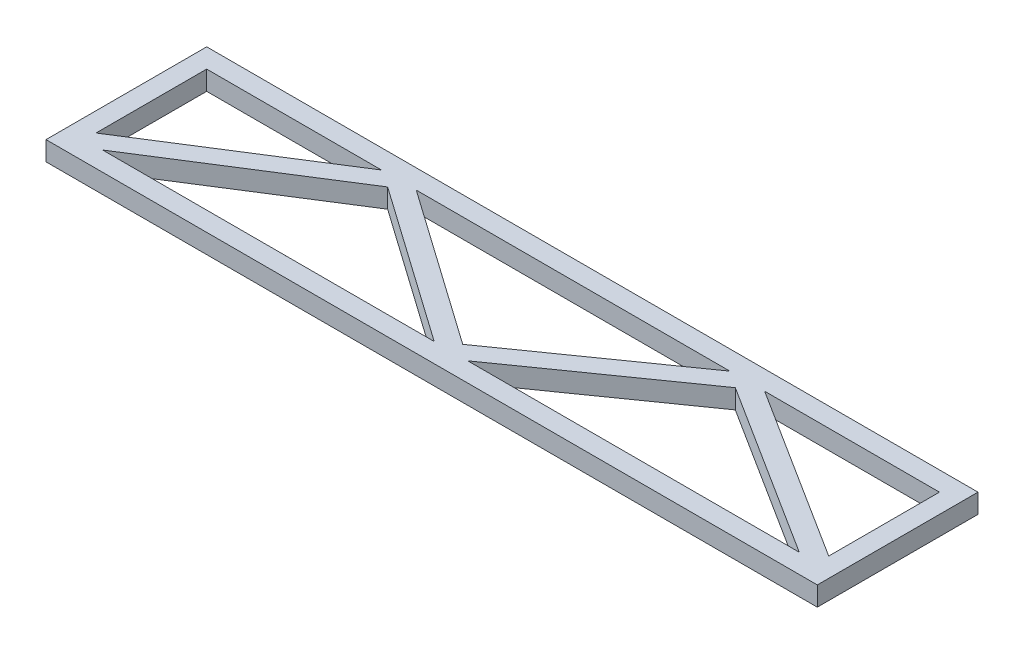
ISO-10303-21;
HEADER;
FILE_DESCRIPTION(('STEP AP214'),'2;1');
FILE_NAME('part.step','',(''),(''),'','','');
FILE_SCHEMA(('AUTOMOTIVE_DESIGN { 1 0 10303 214 1 1 1 1 }'));
ENDSEC;
DATA;
#1=APPLICATION_CONTEXT('core data for automotive mechanical design processes');
#2=APPLICATION_PROTOCOL_DEFINITION('international standard','automotive_design',2000,#1);
#3=PRODUCT_CONTEXT('',#1,'mechanical');
#4=PRODUCT('Part','Part','',(#3));
#5=PRODUCT_RELATED_PRODUCT_CATEGORY('part','',(#4));
#6=PRODUCT_DEFINITION_FORMATION('','',#4);
#7=PRODUCT_DEFINITION_CONTEXT('part definition',#1,'design');
#8=PRODUCT_DEFINITION('design','',#6,#7);
#9=PRODUCT_DEFINITION_SHAPE('','',#8);
#10=(LENGTH_UNIT() NAMED_UNIT(*) SI_UNIT(.MILLI.,.METRE.));
#11=(NAMED_UNIT(*) PLANE_ANGLE_UNIT() SI_UNIT($,.RADIAN.));
#12=(NAMED_UNIT(*) SI_UNIT($,.STERADIAN.) SOLID_ANGLE_UNIT());
#13=UNCERTAINTY_MEASURE_WITH_UNIT(LENGTH_MEASURE(1.E-05),#10,'distance_accuracy_value','');
#14=(GEOMETRIC_REPRESENTATION_CONTEXT(3) GLOBAL_UNCERTAINTY_ASSIGNED_CONTEXT((#13)) GLOBAL_UNIT_ASSIGNED_CONTEXT((#10,
#11,#12)) REPRESENTATION_CONTEXT('',''));
#15=CARTESIAN_POINT('',(0.,0.,0.));
#16=DIRECTION('',(0.,0.,1.));
#17=DIRECTION('',(1.,0.,0.));
#18=AXIS2_PLACEMENT_3D('',#15,#16,#17);
#19=CARTESIAN_POINT('',(0.,3.,0.));
#20=DIRECTION('',(0.,-1.,0.));
#21=DIRECTION('',(0.,0.,-1.));
#22=AXIS2_PLACEMENT_3D('',#19,#20,#21);
#23=PLANE('',#22);
#24=DIRECTION('',(1.,0.,0.));
#25=VECTOR('',#24,1.);
#26=CARTESIAN_POINT('',(36.2724669608045,3.,9.5));
#27=LINE('',#26,#25);
#28=CARTESIAN_POINT('',(36.2724669608045,3.,9.5));
#29=VERTEX_POINT('',#28);
#30=CARTESIAN_POINT('',(87.8625424991544,3.,9.5));
#31=VERTEX_POINT('',#30);
#32=EDGE_CURVE('E197',#29,#31,#27,.T.);
#33=ORIENTED_EDGE('',*,*,#32,.F.);
#34=DIRECTION('',(-0.817806419300766,0.,0.575493406174614));
#35=VECTOR('',#34,1.);
#36=CARTESIAN_POINT('',(60.7098711631808,3.,-7.69669184611664));
#37=LINE('',#36,#35);
#38=CARTESIAN_POINT('',(60.7098711631808,3.,-7.69669184611664));
#39=VERTEX_POINT('',#38);
#40=EDGE_CURVE('E203',#39,#29,#37,.T.);
#41=ORIENTED_EDGE('',*,*,#40,.F.);
#42=DIRECTION('',(-0.844819075554229,0.,-0.535052081184345));
#43=VECTOR('',#42,1.);
#44=CARTESIAN_POINT('',(87.8625424991544,3.,9.5));
#45=LINE('',#44,#43);
#46=EDGE_CURVE('E199',#31,#39,#45,.T.);
#47=ORIENTED_EDGE('',*,*,#46,.F.);
#48=EDGE_LOOP('',(#33,#41,#47));
#49=FACE_BOUND('',#48,.T.);
#50=DIRECTION('',(-1.,0.,0.));
#51=VECTOR('',#50,1.);
#52=CARTESIAN_POINT('',(63.4694733111222,3.,-9.50000000000001));
#53=LINE('',#52,#51);
#54=CARTESIAN_POINT('',(90.6660079051383,3.,-9.5));
#55=VERTEX_POINT('',#54);
#56=CARTESIAN_POINT('',(63.4694733111222,3.,-9.50000000000001));
#57=VERTEX_POINT('',#56);
#58=EDGE_CURVE('E245',#55,#57,#53,.T.);
#59=ORIENTED_EDGE('',*,*,#58,.F.);
#60=DIRECTION('',(0.,0.,-1.));
#61=VECTOR('',#60,1.);
#62=CARTESIAN_POINT('',(90.6660079051383,3.,7.72447190954353));
#63=LINE('',#62,#61);
#64=CARTESIAN_POINT('',(90.6660079051383,3.,7.72447190954353));
#65=VERTEX_POINT('',#64);
#66=EDGE_CURVE('E251',#65,#55,#63,.T.);
#67=ORIENTED_EDGE('',*,*,#66,.F.);
#68=DIRECTION('',(0.844819075554229,0.,0.535052081184345));
#69=VECTOR('',#68,1.);
#70=CARTESIAN_POINT('',(90.6660079051383,3.,7.72447190954353));
#71=LINE('',#70,#69);
#72=EDGE_CURVE('E247',#57,#65,#71,.T.);
#73=ORIENTED_EDGE('',*,*,#72,.F.);
#74=EDGE_LOOP('',(#59,#67,#73));
#75=FACE_BOUND('',#74,.T.);
#76=DIRECTION('',(0.,0.,-1.));
#77=VECTOR('',#76,1.);
#78=CARTESIAN_POINT('',(93.6660079051383,3.,12.5));
#79=LINE('',#78,#77);
#80=CARTESIAN_POINT('',(93.6660079051383,3.,12.5));
#81=VERTEX_POINT('',#80);
#82=CARTESIAN_POINT('',(93.6660079051383,3.,-12.5));
#83=VERTEX_POINT('',#82);
#84=EDGE_CURVE('E293',#81,#83,#79,.T.);
#85=ORIENTED_EDGE('',*,*,#84,.T.);
#86=DIRECTION('',(-1.,0.,0.));
#87=VECTOR('',#86,1.);
#88=CARTESIAN_POINT('',(-26.3339920948617,3.,-12.5));
#89=LINE('',#88,#87);
#90=CARTESIAN_POINT('',(-26.3339920948617,3.,-12.5));
#91=VERTEX_POINT('',#90);
#92=EDGE_CURVE('E296',#83,#91,#89,.T.);
#93=ORIENTED_EDGE('',*,*,#92,.T.);
#94=DIRECTION('',(0.,0.,1.));
#95=VECTOR('',#94,1.);
#96=CARTESIAN_POINT('',(-26.3339920948617,3.,12.5));
#97=LINE('',#96,#95);
#98=CARTESIAN_POINT('',(-26.3339920948617,3.,12.5));
#99=VERTEX_POINT('',#98);
#100=EDGE_CURVE('E299',#91,#99,#97,.T.);
#101=ORIENTED_EDGE('',*,*,#100,.T.);
#102=DIRECTION('',(1.,0.,0.));
#103=VECTOR('',#102,1.);
#104=CARTESIAN_POINT('',(-26.3339920948617,3.,12.5));
#105=LINE('',#104,#103);
#106=EDGE_CURVE('E301',#99,#81,#105,.T.);
#107=ORIENTED_EDGE('',*,*,#106,.T.);
#108=EDGE_LOOP('',(#85,#93,#101,#107));
#109=FACE_BOUND('',#108,.T.);
#110=DIRECTION('',(-1.,0.,0.));
#111=VECTOR('',#110,1.);
#112=CARTESIAN_POINT('',(-23.3339920948617,3.,-9.5));
#113=LINE('',#112,#111);
#114=CARTESIAN_POINT('',(3.86254249915444,3.,-9.5));
#115=VERTEX_POINT('',#114);
#116=CARTESIAN_POINT('',(-23.3339920948617,3.,-9.5));
#117=VERTEX_POINT('',#116);
#118=EDGE_CURVE('E269',#115,#117,#113,.T.);
#119=ORIENTED_EDGE('',*,*,#118,.F.);
#120=DIRECTION('',(0.844819075554228,0.,-0.535052081184345));
#121=VECTOR('',#120,1.);
#122=CARTESIAN_POINT('',(-23.3339920948617,3.,7.72447190954353));
#123=LINE('',#122,#121);
#124=CARTESIAN_POINT('',(-23.3339920948617,3.,7.72447190954353));
#125=VERTEX_POINT('',#124);
#126=EDGE_CURVE('E275',#125,#115,#123,.T.);
#127=ORIENTED_EDGE('',*,*,#126,.F.);
#128=DIRECTION('',(0.,0.,1.));
#129=VECTOR('',#128,1.);
#130=CARTESIAN_POINT('',(-23.3339920948617,3.,7.72447190954353));
#131=LINE('',#130,#129);
#132=EDGE_CURVE('E271',#117,#125,#131,.T.);
#133=ORIENTED_EDGE('',*,*,#132,.F.);
#134=EDGE_LOOP('',(#119,#127,#133));
#135=FACE_BOUND('',#134,.T.);
#136=DIRECTION('',(-0.817806419300766,0.,-0.575493406174614));
#137=VECTOR('',#136,1.);
#138=CARTESIAN_POINT('',(6.62214464709587,3.,-7.69669184611664));
#139=LINE('',#138,#137);
#140=CARTESIAN_POINT('',(31.0595488494721,3.,9.5));
#141=VERTEX_POINT('',#140);
#142=CARTESIAN_POINT('',(6.62214464709587,3.,-7.69669184611664));
#143=VERTEX_POINT('',#142);
#144=EDGE_CURVE('E221',#141,#143,#139,.T.);
#145=ORIENTED_EDGE('',*,*,#144,.F.);
#146=DIRECTION('',(1.,0.,0.));
#147=VECTOR('',#146,1.);
#148=CARTESIAN_POINT('',(-20.5305266888778,3.,9.5));
#149=LINE('',#148,#147);
#150=CARTESIAN_POINT('',(-20.5305266888778,3.,9.5));
#151=VERTEX_POINT('',#150);
#152=EDGE_CURVE('E227',#151,#141,#149,.T.);
#153=ORIENTED_EDGE('',*,*,#152,.F.);
#154=DIRECTION('',(-0.844819075554229,0.,0.535052081184345));
#155=VECTOR('',#154,1.);
#156=CARTESIAN_POINT('',(-20.5305266888778,3.,9.5));
#157=LINE('',#156,#155);
#158=EDGE_CURVE('E223',#143,#151,#157,.T.);
#159=ORIENTED_EDGE('',*,*,#158,.F.);
#160=EDGE_LOOP('',(#145,#153,#159));
#161=FACE_BOUND('',#160,.T.);
#162=DIRECTION('',(0.817806419300767,0.,-0.575493406174613));
#163=VECTOR('',#162,1.);
#164=CARTESIAN_POINT('',(58.0595488494722,3.,-9.50000000000001));
#165=LINE('',#164,#163);
#166=CARTESIAN_POINT('',(33.6660079051383,3.,7.66582510897565));
#167=VERTEX_POINT('',#166);
#168=CARTESIAN_POINT('',(58.0595488494722,3.,-9.50000000000001));
#169=VERTEX_POINT('',#168);
#170=EDGE_CURVE('E170',#167,#169,#165,.T.);
#171=ORIENTED_EDGE('',*,*,#170,.F.);
#172=DIRECTION('',(0.817806419300767,0.,0.575493406174613));
#173=VECTOR('',#172,1.);
#174=CARTESIAN_POINT('',(9.2724669608045,3.,-9.50000000000001));
#175=LINE('',#174,#173);
#176=CARTESIAN_POINT('',(9.2724669608045,3.,-9.50000000000001));
#177=VERTEX_POINT('',#176);
#178=EDGE_CURVE('E187',#177,#167,#175,.T.);
#179=ORIENTED_EDGE('',*,*,#178,.F.);
#180=DIRECTION('',(-1.,0.,0.));
#181=VECTOR('',#180,1.);
#182=CARTESIAN_POINT('',(9.2724669608045,3.,-9.50000000000001));
#183=LINE('',#182,#181);
#184=EDGE_CURVE('E178',#169,#177,#183,.T.);
#185=ORIENTED_EDGE('',*,*,#184,.F.);
#186=EDGE_LOOP('',(#171,#179,#185));
#187=FACE_BOUND('',#186,.T.);
#188=ADVANCED_FACE('F39',(#49,#75,#109,#135,#161,#187),#23,.F.);
#189=CARTESIAN_POINT('',(0.,0.,0.));
#190=DIRECTION('',(0.,-1.,0.));
#191=DIRECTION('',(0.,0.,-1.));
#192=AXIS2_PLACEMENT_3D('',#189,#190,#191);
#193=PLANE('',#192);
#194=DIRECTION('',(0.,0.,-1.));
#195=VECTOR('',#194,1.);
#196=CARTESIAN_POINT('',(93.6660079051383,0.,12.5));
#197=LINE('',#196,#195);
#198=CARTESIAN_POINT('',(93.6660079051383,0.,12.5));
#199=VERTEX_POINT('',#198);
#200=CARTESIAN_POINT('',(93.6660079051383,0.,-12.5));
#201=VERTEX_POINT('',#200);
#202=EDGE_CURVE('E292',#199,#201,#197,.T.);
#203=ORIENTED_EDGE('',*,*,#202,.F.);
#204=DIRECTION('',(1.,0.,0.));
#205=VECTOR('',#204,1.);
#206=CARTESIAN_POINT('',(-26.3339920948617,0.,12.5));
#207=LINE('',#206,#205);
#208=CARTESIAN_POINT('',(-26.3339920948617,0.,12.5));
#209=VERTEX_POINT('',#208);
#210=EDGE_CURVE('E297',#209,#199,#207,.T.);
#211=ORIENTED_EDGE('',*,*,#210,.F.);
#212=DIRECTION('',(0.,0.,1.));
#213=VECTOR('',#212,1.);
#214=CARTESIAN_POINT('',(-26.3339920948617,0.,12.5));
#215=LINE('',#214,#213);
#216=CARTESIAN_POINT('',(-26.3339920948617,0.,-12.5));
#217=VERTEX_POINT('',#216);
#218=EDGE_CURVE('E308',#217,#209,#215,.T.);
#219=ORIENTED_EDGE('',*,*,#218,.F.);
#220=DIRECTION('',(-1.,0.,0.));
#221=VECTOR('',#220,1.);
#222=CARTESIAN_POINT('',(-26.3339920948617,0.,-12.5));
#223=LINE('',#222,#221);
#224=EDGE_CURVE('E306',#201,#217,#223,.T.);
#225=ORIENTED_EDGE('',*,*,#224,.F.);
#226=EDGE_LOOP('',(#203,#211,#219,#225));
#227=FACE_BOUND('',#226,.T.);
#228=DIRECTION('',(0.844819075554228,0.,-0.535052081184345));
#229=VECTOR('',#228,1.);
#230=CARTESIAN_POINT('',(-23.3339920948617,0.,7.72447190954353));
#231=LINE('',#230,#229);
#232=CARTESIAN_POINT('',(-23.3339920948617,0.,7.72447190954353));
#233=VERTEX_POINT('',#232);
#234=CARTESIAN_POINT('',(3.86254249915444,0.,-9.50000000000001));
#235=VERTEX_POINT('',#234);
#236=EDGE_CURVE('E272',#233,#235,#231,.T.);
#237=ORIENTED_EDGE('',*,*,#236,.T.);
#238=DIRECTION('',(-1.,0.,0.));
#239=VECTOR('',#238,1.);
#240=CARTESIAN_POINT('',(-23.3339920948617,0.,-9.5));
#241=LINE('',#240,#239);
#242=CARTESIAN_POINT('',(-23.3339920948617,0.,-9.5));
#243=VERTEX_POINT('',#242);
#244=EDGE_CURVE('E268',#235,#243,#241,.T.);
#245=ORIENTED_EDGE('',*,*,#244,.T.);
#246=DIRECTION('',(0.,0.,1.));
#247=VECTOR('',#246,1.);
#248=CARTESIAN_POINT('',(-23.3339920948617,0.,7.72447190954353));
#249=LINE('',#248,#247);
#250=EDGE_CURVE('E280',#243,#233,#249,.T.);
#251=ORIENTED_EDGE('',*,*,#250,.T.);
#252=EDGE_LOOP('',(#237,#245,#251));
#253=FACE_BOUND('',#252,.T.);
#254=DIRECTION('',(0.,0.,-1.));
#255=VECTOR('',#254,1.);
#256=CARTESIAN_POINT('',(90.6660079051383,0.,7.72447190954353));
#257=LINE('',#256,#255);
#258=CARTESIAN_POINT('',(90.6660079051383,0.,7.72447190954353));
#259=VERTEX_POINT('',#258);
#260=CARTESIAN_POINT('',(90.6660079051383,0.,-9.5));
#261=VERTEX_POINT('',#260);
#262=EDGE_CURVE('E248',#259,#261,#257,.T.);
#263=ORIENTED_EDGE('',*,*,#262,.T.);
#264=DIRECTION('',(-1.,0.,0.));
#265=VECTOR('',#264,1.);
#266=CARTESIAN_POINT('',(63.4694733111222,0.,-9.50000000000001));
#267=LINE('',#266,#265);
#268=CARTESIAN_POINT('',(63.4694733111222,0.,-9.50000000000001));
#269=VERTEX_POINT('',#268);
#270=EDGE_CURVE('E244',#261,#269,#267,.T.);
#271=ORIENTED_EDGE('',*,*,#270,.T.);
#272=DIRECTION('',(0.844819075554229,0.,0.535052081184345));
#273=VECTOR('',#272,1.);
#274=CARTESIAN_POINT('',(90.6660079051383,0.,7.72447190954353));
#275=LINE('',#274,#273);
#276=EDGE_CURVE('E256',#269,#259,#275,.T.);
#277=ORIENTED_EDGE('',*,*,#276,.T.);
#278=EDGE_LOOP('',(#263,#271,#277));
#279=FACE_BOUND('',#278,.T.);
#280=DIRECTION('',(1.,0.,0.));
#281=VECTOR('',#280,1.);
#282=CARTESIAN_POINT('',(-20.5305266888778,0.,9.5));
#283=LINE('',#282,#281);
#284=CARTESIAN_POINT('',(-20.5305266888778,0.,9.5));
#285=VERTEX_POINT('',#284);
#286=CARTESIAN_POINT('',(31.0595488494721,0.,9.5));
#287=VERTEX_POINT('',#286);
#288=EDGE_CURVE('E224',#285,#287,#283,.T.);
#289=ORIENTED_EDGE('',*,*,#288,.T.);
#290=DIRECTION('',(-0.817806419300766,0.,-0.575493406174614));
#291=VECTOR('',#290,1.);
#292=CARTESIAN_POINT('',(6.62214464709587,0.,-7.69669184611664));
#293=LINE('',#292,#291);
#294=CARTESIAN_POINT('',(6.62214464709587,0.,-7.69669184611664));
#295=VERTEX_POINT('',#294);
#296=EDGE_CURVE('E220',#287,#295,#293,.T.);
#297=ORIENTED_EDGE('',*,*,#296,.T.);
#298=DIRECTION('',(-0.844819075554229,0.,0.535052081184345));
#299=VECTOR('',#298,1.);
#300=CARTESIAN_POINT('',(-20.5305266888778,0.,9.5));
#301=LINE('',#300,#299);
#302=EDGE_CURVE('E232',#295,#285,#301,.T.);
#303=ORIENTED_EDGE('',*,*,#302,.T.);
#304=EDGE_LOOP('',(#289,#297,#303));
#305=FACE_BOUND('',#304,.T.);
#306=DIRECTION('',(-0.817806419300766,0.,0.575493406174614));
#307=VECTOR('',#306,1.);
#308=CARTESIAN_POINT('',(60.7098711631808,0.,-7.69669184611664));
#309=LINE('',#308,#307);
#310=CARTESIAN_POINT('',(60.7098711631808,0.,-7.69669184611664));
#311=VERTEX_POINT('',#310);
#312=CARTESIAN_POINT('',(36.2724669608045,0.,9.5));
#313=VERTEX_POINT('',#312);
#314=EDGE_CURVE('E200',#311,#313,#309,.T.);
#315=ORIENTED_EDGE('',*,*,#314,.T.);
#316=DIRECTION('',(1.,0.,0.));
#317=VECTOR('',#316,1.);
#318=CARTESIAN_POINT('',(36.2724669608045,0.,9.5));
#319=LINE('',#318,#317);
#320=CARTESIAN_POINT('',(87.8625424991544,0.,9.5));
#321=VERTEX_POINT('',#320);
#322=EDGE_CURVE('E185',#313,#321,#319,.T.);
#323=ORIENTED_EDGE('',*,*,#322,.T.);
#324=DIRECTION('',(-0.844819075554229,0.,-0.535052081184345));
#325=VECTOR('',#324,1.);
#326=CARTESIAN_POINT('',(87.8625424991544,0.,9.5));
#327=LINE('',#326,#325);
#328=EDGE_CURVE('E208',#321,#311,#327,.T.);
#329=ORIENTED_EDGE('',*,*,#328,.T.);
#330=EDGE_LOOP('',(#315,#323,#329));
#331=FACE_BOUND('',#330,.T.);
#332=DIRECTION('',(0.817806419300767,0.,0.575493406174613));
#333=VECTOR('',#332,1.);
#334=CARTESIAN_POINT('',(9.2724669608045,0.,-9.50000000000001));
#335=LINE('',#334,#333);
#336=CARTESIAN_POINT('',(9.2724669608045,0.,-9.50000000000001));
#337=VERTEX_POINT('',#336);
#338=CARTESIAN_POINT('',(33.6660079051383,0.,7.66582510897565));
#339=VERTEX_POINT('',#338);
#340=EDGE_CURVE('E179',#337,#339,#335,.T.);
#341=ORIENTED_EDGE('',*,*,#340,.T.);
#342=DIRECTION('',(0.817806419300767,0.,-0.575493406174613));
#343=VECTOR('',#342,1.);
#344=CARTESIAN_POINT('',(58.0595488494722,0.,-9.50000000000001));
#345=LINE('',#344,#343);
#346=CARTESIAN_POINT('',(58.0595488494722,0.,-9.50000000000001));
#347=VERTEX_POINT('',#346);
#348=EDGE_CURVE('E62',#339,#347,#345,.T.);
#349=ORIENTED_EDGE('',*,*,#348,.T.);
#350=DIRECTION('',(-1.,0.,0.));
#351=VECTOR('',#350,1.);
#352=CARTESIAN_POINT('',(9.2724669608045,0.,-9.50000000000001));
#353=LINE('',#352,#351);
#354=EDGE_CURVE('E184',#347,#337,#353,.T.);
#355=ORIENTED_EDGE('',*,*,#354,.T.);
#356=EDGE_LOOP('',(#341,#349,#355));
#357=FACE_BOUND('',#356,.T.);
#358=ADVANCED_FACE('F326',(#227,#253,#279,#305,#331,#357),#193,.T.);
#359=CARTESIAN_POINT('',(93.6660079051383,3.,12.5));
#360=DIRECTION('',(-1.,0.,0.));
#361=DIRECTION('',(0.,0.,1.));
#362=AXIS2_PLACEMENT_3D('',#359,#360,#361);
#363=PLANE('',#362);
#364=ORIENTED_EDGE('',*,*,#202,.T.);
#365=DIRECTION('',(0.,-1.,0.));
#366=VECTOR('',#365,1.);
#367=CARTESIAN_POINT('',(93.6660079051383,3.,-12.5));
#368=LINE('',#367,#366);
#369=EDGE_CURVE('E11',#83,#201,#368,.T.);
#370=ORIENTED_EDGE('',*,*,#369,.F.);
#371=ORIENTED_EDGE('',*,*,#84,.F.);
#372=DIRECTION('',(0.,-1.,0.));
#373=VECTOR('',#372,1.);
#374=CARTESIAN_POINT('',(93.6660079051383,3.,12.5));
#375=LINE('',#374,#373);
#376=EDGE_CURVE('E303',#81,#199,#375,.T.);
#377=ORIENTED_EDGE('',*,*,#376,.T.);
#378=EDGE_LOOP('',(#364,#370,#371,#377));
#379=FACE_BOUND('',#378,.T.);
#380=ADVANCED_FACE('F41',(#379),#363,.F.);
#381=CARTESIAN_POINT('',(-26.3339920948617,3.,-12.5));
#382=DIRECTION('',(0.,0.,1.));
#383=DIRECTION('',(1.,0.,0.));
#384=AXIS2_PLACEMENT_3D('',#381,#382,#383);
#385=PLANE('',#384);
#386=ORIENTED_EDGE('',*,*,#224,.T.);
#387=DIRECTION('',(0.,-1.,0.));
#388=VECTOR('',#387,1.);
#389=CARTESIAN_POINT('',(-26.3339920948617,3.,-12.5));
#390=LINE('',#389,#388);
#391=EDGE_CURVE('E47',#91,#217,#390,.T.);
#392=ORIENTED_EDGE('',*,*,#391,.F.);
#393=ORIENTED_EDGE('',*,*,#92,.F.);
#394=ORIENTED_EDGE('',*,*,#369,.T.);
#395=EDGE_LOOP('',(#386,#392,#393,#394));
#396=FACE_BOUND('',#395,.T.);
#397=ADVANCED_FACE('F337',(#396),#385,.F.);
#398=CARTESIAN_POINT('',(-26.3339920948617,3.,12.5));
#399=DIRECTION('',(1.,0.,0.));
#400=DIRECTION('',(0.,0.,-1.));
#401=AXIS2_PLACEMENT_3D('',#398,#399,#400);
#402=PLANE('',#401);
#403=ORIENTED_EDGE('',*,*,#218,.T.);
#404=DIRECTION('',(0.,-1.,0.));
#405=VECTOR('',#404,1.);
#406=CARTESIAN_POINT('',(-26.3339920948617,3.,12.5));
#407=LINE('',#406,#405);
#408=EDGE_CURVE('E313',#99,#209,#407,.T.);
#409=ORIENTED_EDGE('',*,*,#408,.F.);
#410=ORIENTED_EDGE('',*,*,#100,.F.);
#411=ORIENTED_EDGE('',*,*,#391,.T.);
#412=EDGE_LOOP('',(#403,#409,#410,#411));
#413=FACE_BOUND('',#412,.T.);
#414=ADVANCED_FACE('F320',(#413),#402,.F.);
#415=CARTESIAN_POINT('',(-26.3339920948617,3.,12.5));
#416=DIRECTION('',(0.,0.,-1.));
#417=DIRECTION('',(-1.,0.,0.));
#418=AXIS2_PLACEMENT_3D('',#415,#416,#417);
#419=PLANE('',#418);
#420=ORIENTED_EDGE('',*,*,#210,.T.);
#421=ORIENTED_EDGE('',*,*,#376,.F.);
#422=ORIENTED_EDGE('',*,*,#106,.F.);
#423=ORIENTED_EDGE('',*,*,#408,.T.);
#424=EDGE_LOOP('',(#420,#421,#422,#423));
#425=FACE_BOUND('',#424,.T.);
#426=ADVANCED_FACE('F330',(#425),#419,.F.);
#427=CARTESIAN_POINT('',(-23.3339920948617,3.,-9.5));
#428=DIRECTION('',(0.,0.,1.));
#429=DIRECTION('',(1.,0.,0.));
#430=AXIS2_PLACEMENT_3D('',#427,#428,#429);
#431=PLANE('',#430);
#432=ORIENTED_EDGE('',*,*,#244,.F.);
#433=DIRECTION('',(0.,-1.,0.));
#434=VECTOR('',#433,1.);
#435=CARTESIAN_POINT('',(3.86254249915444,3.,-9.5));
#436=LINE('',#435,#434);
#437=EDGE_CURVE('E277',#115,#235,#436,.T.);
#438=ORIENTED_EDGE('',*,*,#437,.F.);
#439=ORIENTED_EDGE('',*,*,#118,.T.);
#440=DIRECTION('',(0.,-1.,0.));
#441=VECTOR('',#440,1.);
#442=CARTESIAN_POINT('',(-23.3339920948617,3.,-9.5));
#443=LINE('',#442,#441);
#444=EDGE_CURVE('E289',#117,#243,#443,.T.);
#445=ORIENTED_EDGE('',*,*,#444,.T.);
#446=EDGE_LOOP('',(#432,#438,#439,#445));
#447=FACE_BOUND('',#446,.T.);
#448=ADVANCED_FACE('F354',(#447),#431,.T.);
#449=CARTESIAN_POINT('',(-23.3339920948617,3.,7.72447190954353));
#450=DIRECTION('',(1.,0.,0.));
#451=DIRECTION('',(0.,0.,-1.));
#452=AXIS2_PLACEMENT_3D('',#449,#450,#451);
#453=PLANE('',#452);
#454=ORIENTED_EDGE('',*,*,#250,.F.);
#455=ORIENTED_EDGE('',*,*,#444,.F.);
#456=ORIENTED_EDGE('',*,*,#132,.T.);
#457=DIRECTION('',(0.,-1.,0.));
#458=VECTOR('',#457,1.);
#459=CARTESIAN_POINT('',(-23.3339920948617,3.,7.72447190954353));
#460=LINE('',#459,#458);
#461=EDGE_CURVE('E287',#125,#233,#460,.T.);
#462=ORIENTED_EDGE('',*,*,#461,.T.);
#463=EDGE_LOOP('',(#454,#455,#456,#462));
#464=FACE_BOUND('',#463,.T.);
#465=ADVANCED_FACE('F361',(#464),#453,.T.);
#466=CARTESIAN_POINT('',(-23.3339920948617,3.,7.72447190954353));
#467=DIRECTION('',(-0.535052081184345,0.,-0.844819075554228));
#468=DIRECTION('',(-0.844819075554228,0.,0.535052081184345));
#469=AXIS2_PLACEMENT_3D('',#466,#467,#468);
#470=PLANE('',#469);
#471=ORIENTED_EDGE('',*,*,#236,.F.);
#472=ORIENTED_EDGE('',*,*,#461,.F.);
#473=ORIENTED_EDGE('',*,*,#126,.T.);
#474=ORIENTED_EDGE('',*,*,#437,.T.);
#475=EDGE_LOOP('',(#471,#472,#473,#474));
#476=FACE_BOUND('',#475,.T.);
#477=ADVANCED_FACE('F366',(#476),#470,.T.);
#478=CARTESIAN_POINT('',(63.4694733111222,3.,-9.50000000000001));
#479=DIRECTION('',(0.,0.,1.));
#480=DIRECTION('',(1.,0.,0.));
#481=AXIS2_PLACEMENT_3D('',#478,#479,#480);
#482=PLANE('',#481);
#483=ORIENTED_EDGE('',*,*,#270,.F.);
#484=DIRECTION('',(0.,-1.,0.));
#485=VECTOR('',#484,1.);
#486=CARTESIAN_POINT('',(90.6660079051383,3.,-9.5));
#487=LINE('',#486,#485);
#488=EDGE_CURVE('E253',#55,#261,#487,.T.);
#489=ORIENTED_EDGE('',*,*,#488,.F.);
#490=ORIENTED_EDGE('',*,*,#58,.T.);
#491=DIRECTION('',(0.,-1.,0.));
#492=VECTOR('',#491,1.);
#493=CARTESIAN_POINT('',(63.4694733111222,3.,-9.50000000000001));
#494=LINE('',#493,#492);
#495=EDGE_CURVE('E265',#57,#269,#494,.T.);
#496=ORIENTED_EDGE('',*,*,#495,.T.);
#497=EDGE_LOOP('',(#483,#489,#490,#496));
#498=FACE_BOUND('',#497,.T.);
#499=ADVANCED_FACE('F413',(#498),#482,.T.);
#500=CARTESIAN_POINT('',(90.6660079051383,3.,7.72447190954353));
#501=DIRECTION('',(0.535052081184345,0.,-0.844819075554229));
#502=DIRECTION('',(-0.844819075554229,0.,-0.535052081184345));
#503=AXIS2_PLACEMENT_3D('',#500,#501,#502);
#504=PLANE('',#503);
#505=ORIENTED_EDGE('',*,*,#276,.F.);
#506=ORIENTED_EDGE('',*,*,#495,.F.);
#507=ORIENTED_EDGE('',*,*,#72,.T.);
#508=DIRECTION('',(0.,-1.,0.));
#509=VECTOR('',#508,1.);
#510=CARTESIAN_POINT('',(90.6660079051383,3.,7.72447190954353));
#511=LINE('',#510,#509);
#512=EDGE_CURVE('E263',#65,#259,#511,.T.);
#513=ORIENTED_EDGE('',*,*,#512,.T.);
#514=EDGE_LOOP('',(#505,#506,#507,#513));
#515=FACE_BOUND('',#514,.T.);
#516=ADVANCED_FACE('F409',(#515),#504,.T.);
#517=CARTESIAN_POINT('',(90.6660079051383,3.,7.72447190954353));
#518=DIRECTION('',(-1.,0.,0.));
#519=DIRECTION('',(0.,0.,1.));
#520=AXIS2_PLACEMENT_3D('',#517,#518,#519);
#521=PLANE('',#520);
#522=ORIENTED_EDGE('',*,*,#262,.F.);
#523=ORIENTED_EDGE('',*,*,#512,.F.);
#524=ORIENTED_EDGE('',*,*,#66,.T.);
#525=ORIENTED_EDGE('',*,*,#488,.T.);
#526=EDGE_LOOP('',(#522,#523,#524,#525));
#527=FACE_BOUND('',#526,.T.);
#528=ADVANCED_FACE('F406',(#527),#521,.T.);
#529=CARTESIAN_POINT('',(6.62214464709587,3.,-7.69669184611664));
#530=DIRECTION('',(-0.575493406174614,0.,0.817806419300766));
#531=DIRECTION('',(0.817806419300766,0.,0.575493406174614));
#532=AXIS2_PLACEMENT_3D('',#529,#530,#531);
#533=PLANE('',#532);
#534=ORIENTED_EDGE('',*,*,#296,.F.);
#535=DIRECTION('',(0.,-1.,0.));
#536=VECTOR('',#535,1.);
#537=CARTESIAN_POINT('',(31.0595488494721,3.,9.5));
#538=LINE('',#537,#536);
#539=EDGE_CURVE('E229',#141,#287,#538,.T.);
#540=ORIENTED_EDGE('',*,*,#539,.F.);
#541=ORIENTED_EDGE('',*,*,#144,.T.);
#542=DIRECTION('',(0.,-1.,0.));
#543=VECTOR('',#542,1.);
#544=CARTESIAN_POINT('',(6.62214464709587,3.,-7.69669184611664));
#545=LINE('',#544,#543);
#546=EDGE_CURVE('E241',#143,#295,#545,.T.);
#547=ORIENTED_EDGE('',*,*,#546,.T.);
#548=EDGE_LOOP('',(#534,#540,#541,#547));
#549=FACE_BOUND('',#548,.T.);
#550=ADVANCED_FACE('F383',(#549),#533,.T.);
#551=CARTESIAN_POINT('',(-20.5305266888778,3.,9.5));
#552=DIRECTION('',(0.535052081184345,0.,0.844819075554228));
#553=DIRECTION('',(0.844819075554228,0.,-0.535052081184345));
#554=AXIS2_PLACEMENT_3D('',#551,#552,#553);
#555=PLANE('',#554);
#556=ORIENTED_EDGE('',*,*,#302,.F.);
#557=ORIENTED_EDGE('',*,*,#546,.F.);
#558=ORIENTED_EDGE('',*,*,#158,.T.);
#559=DIRECTION('',(0.,-1.,0.));
#560=VECTOR('',#559,1.);
#561=CARTESIAN_POINT('',(-20.5305266888778,3.,9.5));
#562=LINE('',#561,#560);
#563=EDGE_CURVE('E239',#151,#285,#562,.T.);
#564=ORIENTED_EDGE('',*,*,#563,.T.);
#565=EDGE_LOOP('',(#556,#557,#558,#564));
#566=FACE_BOUND('',#565,.T.);
#567=ADVANCED_FACE('F385',(#566),#555,.T.);
#568=CARTESIAN_POINT('',(-20.5305266888778,3.,9.5));
#569=DIRECTION('',(0.,0.,-1.));
#570=DIRECTION('',(-1.,0.,0.));
#571=AXIS2_PLACEMENT_3D('',#568,#569,#570);
#572=PLANE('',#571);
#573=ORIENTED_EDGE('',*,*,#288,.F.);
#574=ORIENTED_EDGE('',*,*,#563,.F.);
#575=ORIENTED_EDGE('',*,*,#152,.T.);
#576=ORIENTED_EDGE('',*,*,#539,.T.);
#577=EDGE_LOOP('',(#573,#574,#575,#576));
#578=FACE_BOUND('',#577,.T.);
#579=ADVANCED_FACE('F390',(#578),#572,.T.);
#580=CARTESIAN_POINT('',(36.2724669608045,3.,9.5));
#581=DIRECTION('',(0.,0.,-1.));
#582=DIRECTION('',(-1.,0.,0.));
#583=AXIS2_PLACEMENT_3D('',#580,#581,#582);
#584=PLANE('',#583);
#585=ORIENTED_EDGE('',*,*,#322,.F.);
#586=DIRECTION('',(0.,-1.,0.));
#587=VECTOR('',#586,1.);
#588=CARTESIAN_POINT('',(36.2724669608045,3.,9.5));
#589=LINE('',#588,#587);
#590=EDGE_CURVE('E205',#29,#313,#589,.T.);
#591=ORIENTED_EDGE('',*,*,#590,.F.);
#592=ORIENTED_EDGE('',*,*,#32,.T.);
#593=DIRECTION('',(0.,-1.,0.));
#594=VECTOR('',#593,1.);
#595=CARTESIAN_POINT('',(87.8625424991544,3.,9.5));
#596=LINE('',#595,#594);
#597=EDGE_CURVE('E217',#31,#321,#596,.T.);
#598=ORIENTED_EDGE('',*,*,#597,.T.);
#599=EDGE_LOOP('',(#585,#591,#592,#598));
#600=FACE_BOUND('',#599,.T.);
#601=ADVANCED_FACE('F392',(#600),#584,.T.);
#602=CARTESIAN_POINT('',(87.8625424991544,3.,9.5));
#603=DIRECTION('',(-0.535052081184345,0.,0.844819075554229));
#604=DIRECTION('',(0.844819075554229,0.,0.535052081184345));
#605=AXIS2_PLACEMENT_3D('',#602,#603,#604);
#606=PLANE('',#605);
#607=ORIENTED_EDGE('',*,*,#328,.F.);
#608=ORIENTED_EDGE('',*,*,#597,.F.);
#609=ORIENTED_EDGE('',*,*,#46,.T.);
#610=DIRECTION('',(0.,-1.,0.));
#611=VECTOR('',#610,1.);
#612=CARTESIAN_POINT('',(60.7098711631808,3.,-7.69669184611664));
#613=LINE('',#612,#611);
#614=EDGE_CURVE('E215',#39,#311,#613,.T.);
#615=ORIENTED_EDGE('',*,*,#614,.T.);
#616=EDGE_LOOP('',(#607,#608,#609,#615));
#617=FACE_BOUND('',#616,.T.);
#618=ADVANCED_FACE('F398',(#617),#606,.T.);
#619=CARTESIAN_POINT('',(60.7098711631808,3.,-7.69669184611664));
#620=DIRECTION('',(0.575493406174614,0.,0.817806419300766));
#621=DIRECTION('',(0.817806419300766,0.,-0.575493406174614));
#622=AXIS2_PLACEMENT_3D('',#619,#620,#621);
#623=PLANE('',#622);
#624=ORIENTED_EDGE('',*,*,#314,.F.);
#625=ORIENTED_EDGE('',*,*,#614,.F.);
#626=ORIENTED_EDGE('',*,*,#40,.T.);
#627=ORIENTED_EDGE('',*,*,#590,.T.);
#628=EDGE_LOOP('',(#624,#625,#626,#627));
#629=FACE_BOUND('',#628,.T.);
#630=ADVANCED_FACE('F468',(#629),#623,.T.);
#631=CARTESIAN_POINT('',(58.0595488494722,3.,-9.50000000000001));
#632=DIRECTION('',(-0.575493406174613,0.,-0.817806419300767));
#633=DIRECTION('',(-0.817806419300767,0.,0.575493406174613));
#634=AXIS2_PLACEMENT_3D('',#631,#632,#633);
#635=PLANE('',#634);
#636=ORIENTED_EDGE('',*,*,#348,.F.);
#637=DIRECTION('',(0.,-1.,0.));
#638=VECTOR('',#637,1.);
#639=CARTESIAN_POINT('',(33.6660079051383,3.,7.66582510897565));
#640=LINE('',#639,#638);
#641=EDGE_CURVE('E174',#167,#339,#640,.T.);
#642=ORIENTED_EDGE('',*,*,#641,.F.);
#643=ORIENTED_EDGE('',*,*,#170,.T.);
#644=DIRECTION('',(0.,-1.,0.));
#645=VECTOR('',#644,1.);
#646=CARTESIAN_POINT('',(58.0595488494722,3.,-9.50000000000001));
#647=LINE('',#646,#645);
#648=EDGE_CURVE('E173',#169,#347,#647,.T.);
#649=ORIENTED_EDGE('',*,*,#648,.T.);
#650=EDGE_LOOP('',(#636,#642,#643,#649));
#651=FACE_BOUND('',#650,.T.);
#652=ADVANCED_FACE('F172',(#651),#635,.T.);
#653=CARTESIAN_POINT('',(9.2724669608045,3.,-9.50000000000001));
#654=DIRECTION('',(0.,0.,1.));
#655=DIRECTION('',(1.,0.,0.));
#656=AXIS2_PLACEMENT_3D('',#653,#654,#655);
#657=PLANE('',#656);
#658=ORIENTED_EDGE('',*,*,#354,.F.);
#659=ORIENTED_EDGE('',*,*,#648,.F.);
#660=ORIENTED_EDGE('',*,*,#184,.T.);
#661=DIRECTION('',(0.,-1.,0.));
#662=VECTOR('',#661,1.);
#663=CARTESIAN_POINT('',(9.2724669608045,3.,-9.50000000000001));
#664=LINE('',#663,#662);
#665=EDGE_CURVE('E54',#177,#337,#664,.T.);
#666=ORIENTED_EDGE('',*,*,#665,.T.);
#667=EDGE_LOOP('',(#658,#659,#660,#666));
#668=FACE_BOUND('',#667,.T.);
#669=ADVANCED_FACE('F182',(#668),#657,.T.);
#670=CARTESIAN_POINT('',(9.2724669608045,3.,-9.50000000000001));
#671=DIRECTION('',(0.575493406174613,0.,-0.817806419300767));
#672=DIRECTION('',(-0.817806419300767,0.,-0.575493406174613));
#673=AXIS2_PLACEMENT_3D('',#670,#671,#672);
#674=PLANE('',#673);
#675=ORIENTED_EDGE('',*,*,#340,.F.);
#676=ORIENTED_EDGE('',*,*,#665,.F.);
#677=ORIENTED_EDGE('',*,*,#178,.T.);
#678=ORIENTED_EDGE('',*,*,#641,.T.);
#679=EDGE_LOOP('',(#675,#676,#677,#678));
#680=FACE_BOUND('',#679,.T.);
#681=ADVANCED_FACE('F494',(#680),#674,.T.);
#682=CLOSED_SHELL('',(#188,#358,#380,#397,#414,#426,#448,#465,#477,#499,#516,#528,#550,#567,
#579,#601,#618,#630,#652,#669,#681));
#683=MANIFOLD_SOLID_BREP('B2',#682);
#684=ADVANCED_BREP_SHAPE_REPRESENTATION('',(#18,#683),#14);
#685=SHAPE_DEFINITION_REPRESENTATION(#9,#684);
ENDSEC;
END-ISO-10303-21;
